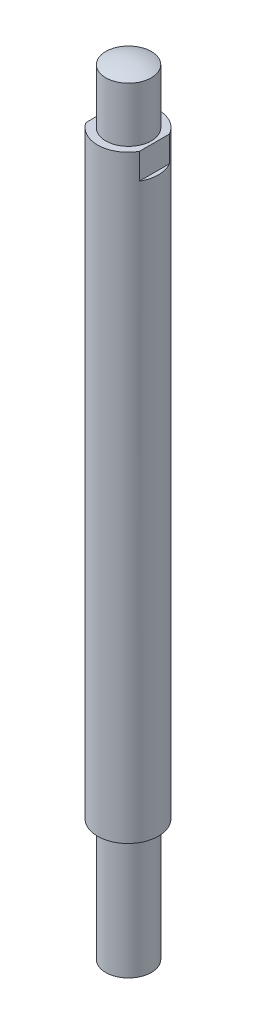
ISO-10303-21;
HEADER;
FILE_DESCRIPTION(('STEP AP214'),'2;1');
FILE_NAME('part.step','',(''),(''),'','','');
FILE_SCHEMA(('AUTOMOTIVE_DESIGN { 1 0 10303 214 1 1 1 1 }'));
ENDSEC;
DATA;
#1=APPLICATION_CONTEXT('core data for automotive mechanical design processes');
#2=APPLICATION_PROTOCOL_DEFINITION('international standard','automotive_design',2000,#1);
#3=PRODUCT_CONTEXT('',#1,'mechanical');
#4=PRODUCT('Part','Part','',(#3));
#5=PRODUCT_RELATED_PRODUCT_CATEGORY('part','',(#4));
#6=PRODUCT_DEFINITION_FORMATION('','',#4);
#7=PRODUCT_DEFINITION_CONTEXT('part definition',#1,'design');
#8=PRODUCT_DEFINITION('design','',#6,#7);
#9=PRODUCT_DEFINITION_SHAPE('','',#8);
#10=(LENGTH_UNIT() NAMED_UNIT(*) SI_UNIT(.MILLI.,.METRE.));
#11=(NAMED_UNIT(*) PLANE_ANGLE_UNIT() SI_UNIT($,.RADIAN.));
#12=(NAMED_UNIT(*) SI_UNIT($,.STERADIAN.) SOLID_ANGLE_UNIT());
#13=UNCERTAINTY_MEASURE_WITH_UNIT(LENGTH_MEASURE(1.E-05),#10,'distance_accuracy_value','');
#14=(GEOMETRIC_REPRESENTATION_CONTEXT(3) GLOBAL_UNCERTAINTY_ASSIGNED_CONTEXT((#13)) GLOBAL_UNIT_ASSIGNED_CONTEXT((#10,
#11,#12)) REPRESENTATION_CONTEXT('',''));
#15=CARTESIAN_POINT('',(0.,0.,0.));
#16=DIRECTION('',(0.,0.,1.));
#17=DIRECTION('',(1.,0.,0.));
#18=AXIS2_PLACEMENT_3D('',#15,#16,#17);
#19=CARTESIAN_POINT('',(0.,-80.,0.));
#20=DIRECTION('',(0.,1.,0.));
#21=DIRECTION('',(0.,0.,1.));
#22=AXIS2_PLACEMENT_3D('',#19,#20,#21);
#23=CYLINDRICAL_SURFACE('',#22,15.);
#24=CARTESIAN_POINT('',(0.,-80.,0.));
#25=DIRECTION('',(0.,1.,0.));
#26=DIRECTION('',(0.,0.,1.));
#27=AXIS2_PLACEMENT_3D('',#24,#25,#26);
#28=CIRCLE('',#27,15.);
#29=CARTESIAN_POINT('',(0.,-80.,15.));
#30=VERTEX_POINT('',#29);
#31=EDGE_CURVE('E12',#30,#30,#28,.T.);
#32=ORIENTED_EDGE('',*,*,#31,.T.);
#33=EDGE_LOOP('',(#32));
#34=FACE_BOUND('',#33,.T.);
#35=CARTESIAN_POINT('',(0.,0.,0.));
#36=DIRECTION('',(0.,1.,0.));
#37=DIRECTION('',(0.,0.,1.));
#38=AXIS2_PLACEMENT_3D('',#35,#36,#37);
#39=CIRCLE('',#38,15.);
#40=CARTESIAN_POINT('',(0.,0.,15.));
#41=VERTEX_POINT('',#40);
#42=EDGE_CURVE('E60',#41,#41,#39,.T.);
#43=ORIENTED_EDGE('',*,*,#42,.F.);
#44=EDGE_LOOP('',(#43));
#45=FACE_BOUND('',#44,.T.);
#46=ADVANCED_FACE('F53',(#34,#45),#23,.T.);
#47=CARTESIAN_POINT('',(0.,-44.,0.));
#48=DIRECTION('',(0.,0.,1.));
#49=DIRECTION('',(1.,0.,0.));
#50=AXIS2_PLACEMENT_3D('',#47,#48,#49);
#51=SPHERICAL_SURFACE('',#50,39.);
#52=CARTESIAN_POINT('',(0.,-44.,0.));
#53=DIRECTION('',(0.,1.,0.));
#54=DIRECTION('',(0.,0.,1.));
#55=AXIS2_PLACEMENT_3D('',#52,#53,#54);
#56=SPHERICAL_SURFACE('',#55,39.);
#57=ORIENTED_EDGE('',*,*,#31,.F.);
#58=EDGE_LOOP('',(#57));
#59=FACE_BOUND('',#58,.T.);
#60=ADVANCED_FACE('F55',(#59),#56,.T.);
#61=CARTESIAN_POINT('',(0.,0.,0.));
#62=DIRECTION('',(0.,1.,0.));
#63=DIRECTION('',(0.,0.,1.));
#64=AXIS2_PLACEMENT_3D('',#61,#62,#63);
#65=PLANE('',#64);
#66=ORIENTED_EDGE('',*,*,#42,.T.);
#67=EDGE_LOOP('',(#66));
#68=FACE_BOUND('',#67,.T.);
#69=ADVANCED_FACE('F66',(#68),#65,.T.);
#70=CLOSED_SHELL('',(#46,#60,#69));
#71=MANIFOLD_SOLID_BREP('B2',#70);
#72=CARTESIAN_POINT('',(0.,430.,0.));
#73=DIRECTION('',(0.,-1.,0.));
#74=DIRECTION('',(0.,0.,-1.));
#75=AXIS2_PLACEMENT_3D('',#72,#73,#74);
#76=CYLINDRICAL_SURFACE('',#75,15.);
#77=CARTESIAN_POINT('',(0.,430.,0.));
#78=DIRECTION('',(0.,1.,0.));
#79=DIRECTION('',(0.,0.,1.));
#80=AXIS2_PLACEMENT_3D('',#77,#78,#79);
#81=CIRCLE('',#80,15.);
#82=CARTESIAN_POINT('',(0.,430.,15.));
#83=VERTEX_POINT('',#82);
#84=EDGE_CURVE('E52',#83,#83,#81,.T.);
#85=ORIENTED_EDGE('',*,*,#84,.F.);
#86=EDGE_LOOP('',(#85));
#87=FACE_BOUND('',#86,.T.);
#88=CARTESIAN_POINT('',(0.,394.,0.));
#89=DIRECTION('',(0.,1.,0.));
#90=DIRECTION('',(0.,0.,1.));
#91=AXIS2_PLACEMENT_3D('',#88,#89,#90);
#92=CIRCLE('',#91,15.);
#93=CARTESIAN_POINT('',(0.,394.,15.));
#94=VERTEX_POINT('',#93);
#95=EDGE_CURVE('E118',#94,#94,#92,.T.);
#96=ORIENTED_EDGE('',*,*,#95,.T.);
#97=EDGE_LOOP('',(#96));
#98=FACE_BOUND('',#97,.T.);
#99=ADVANCED_FACE('F111',(#87,#98),#76,.T.);
#100=CARTESIAN_POINT('',(0.,394.,0.));
#101=DIRECTION('',(0.,0.,1.));
#102=DIRECTION('',(1.,0.,0.));
#103=AXIS2_PLACEMENT_3D('',#100,#101,#102);
#104=SPHERICAL_SURFACE('',#103,39.);
#105=CARTESIAN_POINT('',(0.,394.,0.));
#106=DIRECTION('',(0.,1.,0.));
#107=DIRECTION('',(0.,0.,1.));
#108=AXIS2_PLACEMENT_3D('',#105,#106,#107);
#109=SPHERICAL_SURFACE('',#108,39.);
#110=ORIENTED_EDGE('',*,*,#84,.T.);
#111=EDGE_LOOP('',(#110));
#112=FACE_BOUND('',#111,.T.);
#113=ADVANCED_FACE('F113',(#112),#109,.T.);
#114=CARTESIAN_POINT('',(0.,394.,0.));
#115=DIRECTION('',(0.,1.,0.));
#116=DIRECTION('',(0.,0.,1.));
#117=AXIS2_PLACEMENT_3D('',#114,#115,#116);
#118=PLANE('',#117);
#119=ORIENTED_EDGE('',*,*,#95,.F.);
#120=EDGE_LOOP('',(#119));
#121=FACE_BOUND('',#120,.T.);
#122=ADVANCED_FACE('F125',(#121),#118,.F.);
#123=CLOSED_SHELL('',(#99,#113,#122));
#124=MANIFOLD_SOLID_BREP('B7',#123);
#125=CARTESIAN_POINT('',(-0.371790910776496,394.,0.));
#126=DIRECTION('',(0.,1.,0.));
#127=DIRECTION('',(0.,0.,1.));
#128=AXIS2_PLACEMENT_3D('',#125,#126,#127);
#129=PLANE('',#128);
#130=DIRECTION('',(0.,0.,1.));
#131=VECTOR('',#130,1.);
#132=CARTESIAN_POINT('',(-17.,394.,0.));
#133=LINE('',#132,#131);
#134=CARTESIAN_POINT('',(-17.,394.,-11.1131751756672));
#135=VERTEX_POINT('',#134);
#136=CARTESIAN_POINT('',(-17.,394.,11.1131751756672));
#137=VERTEX_POINT('',#136);
#138=EDGE_CURVE('E203',#135,#137,#133,.T.);
#139=ORIENTED_EDGE('',*,*,#138,.T.);
#140=CARTESIAN_POINT('',(-0.371790910776496,394.,0.));
#141=DIRECTION('',(0.,1.,0.));
#142=DIRECTION('',(0.,0.,1.));
#143=AXIS2_PLACEMENT_3D('',#140,#141,#142);
#144=CIRCLE('',#143,20.);
#145=CARTESIAN_POINT('',(17.,394.,9.91064481011518));
#146=VERTEX_POINT('',#145);
#147=EDGE_CURVE('E171',#137,#146,#144,.T.);
#148=ORIENTED_EDGE('',*,*,#147,.T.);
#149=DIRECTION('',(0.,0.,1.));
#150=VECTOR('',#149,1.);
#151=CARTESIAN_POINT('',(17.,394.,0.));
#152=LINE('',#151,#150);
#153=CARTESIAN_POINT('',(17.,394.,-9.91064481011519));
#154=VERTEX_POINT('',#153);
#155=EDGE_CURVE('E223',#154,#146,#152,.T.);
#156=ORIENTED_EDGE('',*,*,#155,.F.);
#157=EDGE_CURVE('E109',#154,#135,#144,.T.);
#158=ORIENTED_EDGE('',*,*,#157,.T.);
#159=EDGE_LOOP('',(#139,#148,#156,#158));
#160=FACE_BOUND('',#159,.T.);
#161=CARTESIAN_POINT('',(0.,394.,0.));
#162=DIRECTION('',(0.,1.,0.));
#163=DIRECTION('',(0.,0.,1.));
#164=AXIS2_PLACEMENT_3D('',#161,#162,#163);
#165=CIRCLE('',#164,15.);
#166=CARTESIAN_POINT('',(0.,394.,15.));
#167=VERTEX_POINT('',#166);
#168=EDGE_CURVE('E236',#167,#167,#165,.T.);
#169=ORIENTED_EDGE('',*,*,#168,.F.);
#170=EDGE_LOOP('',(#169));
#171=FACE_BOUND('',#170,.T.);
#172=ADVANCED_FACE('F162',(#160,#171),#129,.T.);
#173=CARTESIAN_POINT('',(-0.371790910776496,394.,0.));
#174=DIRECTION('',(0.,-1.,0.));
#175=DIRECTION('',(0.,0.,-1.));
#176=AXIS2_PLACEMENT_3D('',#173,#174,#175);
#177=CYLINDRICAL_SURFACE('',#176,20.);
#178=ORIENTED_EDGE('',*,*,#147,.F.);
#179=DIRECTION('',(0.,-1.,0.));
#180=VECTOR('',#179,1.);
#181=CARTESIAN_POINT('',(-17.,394.,11.1131751756672));
#182=LINE('',#181,#180);
#183=CARTESIAN_POINT('',(-17.,377.,11.1131751756672));
#184=VERTEX_POINT('',#183);
#185=EDGE_CURVE('E209',#137,#184,#182,.T.);
#186=ORIENTED_EDGE('',*,*,#185,.T.);
#187=CARTESIAN_POINT('',(-0.371790910776496,377.,0.));
#188=DIRECTION('',(0.,1.,0.));
#189=DIRECTION('',(0.,0.,1.));
#190=AXIS2_PLACEMENT_3D('',#187,#188,#189);
#191=CIRCLE('',#190,20.);
#192=CARTESIAN_POINT('',(-17.,377.,-11.1131751756672));
#193=VERTEX_POINT('',#192);
#194=EDGE_CURVE('E213',#193,#184,#191,.T.);
#195=ORIENTED_EDGE('',*,*,#194,.F.);
#196=DIRECTION('',(0.,-1.,0.));
#197=VECTOR('',#196,1.);
#198=CARTESIAN_POINT('',(-17.,394.,-11.1131751756672));
#199=LINE('',#198,#197);
#200=EDGE_CURVE('E206',#135,#193,#199,.T.);
#201=ORIENTED_EDGE('',*,*,#200,.F.);
#202=ORIENTED_EDGE('',*,*,#157,.F.);
#203=DIRECTION('',(0.,-1.,0.));
#204=VECTOR('',#203,1.);
#205=CARTESIAN_POINT('',(17.,394.,-9.91064481011519));
#206=LINE('',#205,#204);
#207=CARTESIAN_POINT('',(17.,377.,-9.91064481011519));
#208=VERTEX_POINT('',#207);
#209=EDGE_CURVE('E226',#154,#208,#206,.T.);
#210=ORIENTED_EDGE('',*,*,#209,.T.);
#211=CARTESIAN_POINT('',(-0.371790910776496,377.,0.));
#212=DIRECTION('',(0.,1.,0.));
#213=DIRECTION('',(0.,0.,1.));
#214=AXIS2_PLACEMENT_3D('',#211,#212,#213);
#215=CIRCLE('',#214,20.);
#216=CARTESIAN_POINT('',(17.,377.,9.91064481011519));
#217=VERTEX_POINT('',#216);
#218=EDGE_CURVE('E227',#217,#208,#215,.T.);
#219=ORIENTED_EDGE('',*,*,#218,.F.);
#220=DIRECTION('',(0.,-1.,0.));
#221=VECTOR('',#220,1.);
#222=CARTESIAN_POINT('',(17.,394.,9.91064481011518));
#223=LINE('',#222,#221);
#224=EDGE_CURVE('E229',#146,#217,#223,.T.);
#225=ORIENTED_EDGE('',*,*,#224,.F.);
#226=EDGE_LOOP('',(#178,#186,#195,#201,#202,#210,#219,#225));
#227=FACE_BOUND('',#226,.T.);
#228=CARTESIAN_POINT('',(-0.371790910776496,0.,0.));
#229=DIRECTION('',(0.,1.,0.));
#230=DIRECTION('',(0.,0.,1.));
#231=AXIS2_PLACEMENT_3D('',#228,#229,#230);
#232=CIRCLE('',#231,20.);
#233=CARTESIAN_POINT('',(-0.371790910776496,0.,20.));
#234=VERTEX_POINT('',#233);
#235=EDGE_CURVE('E166',#234,#234,#232,.T.);
#236=ORIENTED_EDGE('',*,*,#235,.T.);
#237=EDGE_LOOP('',(#236));
#238=FACE_BOUND('',#237,.T.);
#239=ADVANCED_FACE('F164',(#227,#238),#177,.T.);
#240=CARTESIAN_POINT('',(-0.371790910776496,0.,0.));
#241=DIRECTION('',(0.,1.,0.));
#242=DIRECTION('',(0.,0.,1.));
#243=AXIS2_PLACEMENT_3D('',#240,#241,#242);
#244=PLANE('',#243);
#245=ORIENTED_EDGE('',*,*,#235,.F.);
#246=EDGE_LOOP('',(#245));
#247=FACE_BOUND('',#246,.T.);
#248=CARTESIAN_POINT('',(0.,0.,0.));
#249=DIRECTION('',(0.,1.,0.));
#250=DIRECTION('',(0.,0.,1.));
#251=AXIS2_PLACEMENT_3D('',#248,#249,#250);
#252=CIRCLE('',#251,15.);
#253=CARTESIAN_POINT('',(0.,0.,15.));
#254=VERTEX_POINT('',#253);
#255=EDGE_CURVE('E219',#254,#254,#252,.T.);
#256=ORIENTED_EDGE('',*,*,#255,.T.);
#257=EDGE_LOOP('',(#256));
#258=FACE_BOUND('',#257,.T.);
#259=ADVANCED_FACE('F243',(#247,#258),#244,.F.);
#260=CARTESIAN_POINT('',(0.,394.,0.));
#261=DIRECTION('',(0.,-1.,0.));
#262=DIRECTION('',(0.,0.,-1.));
#263=AXIS2_PLACEMENT_3D('',#260,#261,#262);
#264=CYLINDRICAL_SURFACE('',#263,15.);
#265=ORIENTED_EDGE('',*,*,#168,.T.);
#266=EDGE_LOOP('',(#265));
#267=FACE_BOUND('',#266,.T.);
#268=ORIENTED_EDGE('',*,*,#255,.F.);
#269=EDGE_LOOP('',(#268));
#270=FACE_BOUND('',#269,.T.);
#271=ADVANCED_FACE('F246',(#267,#270),#264,.F.);
#272=CARTESIAN_POINT('',(17.,394.,0.));
#273=DIRECTION('',(1.,0.,0.));
#274=DIRECTION('',(0.,0.,-1.));
#275=AXIS2_PLACEMENT_3D('',#272,#273,#274);
#276=PLANE('',#275);
#277=DIRECTION('',(0.,0.,1.));
#278=VECTOR('',#277,1.);
#279=CARTESIAN_POINT('',(17.,377.,0.));
#280=LINE('',#279,#278);
#281=EDGE_CURVE('E184',#208,#217,#280,.T.);
#282=ORIENTED_EDGE('',*,*,#281,.F.);
#283=ORIENTED_EDGE('',*,*,#209,.F.);
#284=ORIENTED_EDGE('',*,*,#155,.T.);
#285=ORIENTED_EDGE('',*,*,#224,.T.);
#286=EDGE_LOOP('',(#282,#283,#284,#285));
#287=FACE_BOUND('',#286,.T.);
#288=ADVANCED_FACE('F250',(#287),#276,.T.);
#289=CARTESIAN_POINT('',(0.,377.,0.));
#290=DIRECTION('',(0.,1.,0.));
#291=DIRECTION('',(0.,0.,1.));
#292=AXIS2_PLACEMENT_3D('',#289,#290,#291);
#293=PLANE('',#292);
#294=ORIENTED_EDGE('',*,*,#281,.T.);
#295=ORIENTED_EDGE('',*,*,#218,.T.);
#296=EDGE_LOOP('',(#294,#295));
#297=FACE_BOUND('',#296,.T.);
#298=ADVANCED_FACE('F256',(#297),#293,.T.);
#299=CARTESIAN_POINT('',(-17.,394.,0.));
#300=DIRECTION('',(1.,0.,0.));
#301=DIRECTION('',(0.,0.,-1.));
#302=AXIS2_PLACEMENT_3D('',#299,#300,#301);
#303=PLANE('',#302);
#304=DIRECTION('',(0.,0.,1.));
#305=VECTOR('',#304,1.);
#306=CARTESIAN_POINT('',(-17.,377.,0.));
#307=LINE('',#306,#305);
#308=EDGE_CURVE('E177',#193,#184,#307,.T.);
#309=ORIENTED_EDGE('',*,*,#308,.T.);
#310=ORIENTED_EDGE('',*,*,#185,.F.);
#311=ORIENTED_EDGE('',*,*,#138,.F.);
#312=ORIENTED_EDGE('',*,*,#200,.T.);
#313=EDGE_LOOP('',(#309,#310,#311,#312));
#314=FACE_BOUND('',#313,.T.);
#315=ADVANCED_FACE('F205',(#314),#303,.F.);
#316=CARTESIAN_POINT('',(0.,377.,0.));
#317=DIRECTION('',(0.,1.,0.));
#318=DIRECTION('',(0.,0.,1.));
#319=AXIS2_PLACEMENT_3D('',#316,#317,#318);
#320=PLANE('',#319);
#321=ORIENTED_EDGE('',*,*,#308,.F.);
#322=ORIENTED_EDGE('',*,*,#194,.T.);
#323=EDGE_LOOP('',(#321,#322));
#324=FACE_BOUND('',#323,.T.);
#325=ADVANCED_FACE('F301',(#324),#320,.T.);
#326=CLOSED_SHELL('',(#172,#239,#259,#271,#288,#298,#315,#325));
#327=MANIFOLD_SOLID_BREP('B47',#326);
#328=ADVANCED_BREP_SHAPE_REPRESENTATION('',(#18,#71,#124,#327),#14);
#329=SHAPE_DEFINITION_REPRESENTATION(#9,#328);
ENDSEC;
END-ISO-10303-21;
